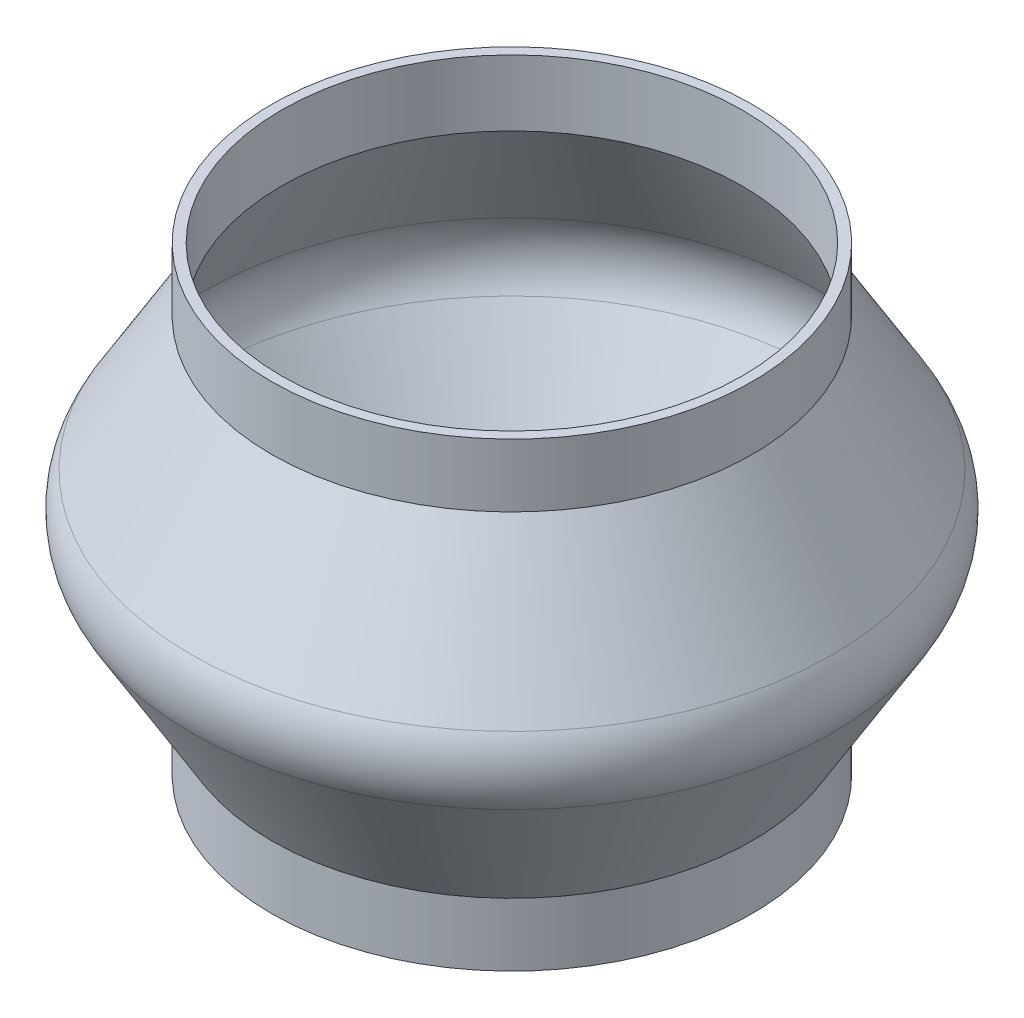
ISO-10303-21;
HEADER;
FILE_DESCRIPTION(('STEP AP214'),'2;1');
FILE_NAME('part.step','',(''),(''),'','','');
FILE_SCHEMA(('AUTOMOTIVE_DESIGN { 1 0 10303 214 1 1 1 1 }'));
ENDSEC;
DATA;
#1=APPLICATION_CONTEXT('core data for automotive mechanical design processes');
#2=APPLICATION_PROTOCOL_DEFINITION('international standard','automotive_design',2000,#1);
#3=PRODUCT_CONTEXT('',#1,'mechanical');
#4=PRODUCT('Part','Part','',(#3));
#5=PRODUCT_RELATED_PRODUCT_CATEGORY('part','',(#4));
#6=PRODUCT_DEFINITION_FORMATION('','',#4);
#7=PRODUCT_DEFINITION_CONTEXT('part definition',#1,'design');
#8=PRODUCT_DEFINITION('design','',#6,#7);
#9=PRODUCT_DEFINITION_SHAPE('','',#8);
#10=(LENGTH_UNIT() NAMED_UNIT(*) SI_UNIT(.MILLI.,.METRE.));
#11=(NAMED_UNIT(*) PLANE_ANGLE_UNIT() SI_UNIT($,.RADIAN.));
#12=(NAMED_UNIT(*) SI_UNIT($,.STERADIAN.) SOLID_ANGLE_UNIT());
#13=UNCERTAINTY_MEASURE_WITH_UNIT(LENGTH_MEASURE(1.E-05),#10,'distance_accuracy_value','');
#14=(GEOMETRIC_REPRESENTATION_CONTEXT(3) GLOBAL_UNCERTAINTY_ASSIGNED_CONTEXT((#13)) GLOBAL_UNIT_ASSIGNED_CONTEXT((#10,
#11,#12)) REPRESENTATION_CONTEXT('',''));
#15=CARTESIAN_POINT('',(0.,0.,0.));
#16=DIRECTION('',(0.,0.,1.));
#17=DIRECTION('',(1.,0.,0.));
#18=AXIS2_PLACEMENT_3D('',#15,#16,#17);
#19=CARTESIAN_POINT('',(-36.5,35.,0.));
#20=DIRECTION('',(0.,1.,0.));
#21=DIRECTION('',(0.,0.,1.));
#22=AXIS2_PLACEMENT_3D('',#19,#20,#21);
#23=PLANE('',#22);
#24=CARTESIAN_POINT('',(0.,35.,0.));
#25=DIRECTION('',(0.,1.,0.));
#26=DIRECTION('',(0.,0.,1.));
#27=AXIS2_PLACEMENT_3D('',#24,#25,#26);
#28=CIRCLE('',#27,36.5);
#29=CARTESIAN_POINT('',(0.,35.,36.5));
#30=VERTEX_POINT('',#29);
#31=EDGE_CURVE('E90',#30,#30,#28,.T.);
#32=ORIENTED_EDGE('',*,*,#31,.T.);
#33=EDGE_LOOP('',(#32));
#34=FACE_BOUND('',#33,.T.);
#35=CARTESIAN_POINT('',(0.,35.,0.));
#36=DIRECTION('',(0.,1.,0.));
#37=DIRECTION('',(0.,0.,1.));
#38=AXIS2_PLACEMENT_3D('',#35,#36,#37);
#39=CIRCLE('',#38,35.);
#40=CARTESIAN_POINT('',(0.,35.,35.));
#41=VERTEX_POINT('',#40);
#42=EDGE_CURVE('E10',#41,#41,#39,.T.);
#43=ORIENTED_EDGE('',*,*,#42,.F.);
#44=EDGE_LOOP('',(#43));
#45=FACE_BOUND('',#44,.T.);
#46=ADVANCED_FACE('F39',(#34,#45),#23,.T.);
#47=CARTESIAN_POINT('',(0.,85.8260869565218,0.));
#48=DIRECTION('',(0.,1.,0.));
#49=DIRECTION('',(0.,0.,1.));
#50=AXIS2_PLACEMENT_3D('',#47,#48,#49);
#51=CYLINDRICAL_SURFACE('',#50,35.);
#52=ORIENTED_EDGE('',*,*,#42,.T.);
#53=EDGE_LOOP('',(#52));
#54=FACE_BOUND('',#53,.T.);
#55=CARTESIAN_POINT('',(0.,25.,0.));
#56=DIRECTION('',(0.,1.,0.));
#57=DIRECTION('',(0.,0.,1.));
#58=AXIS2_PLACEMENT_3D('',#55,#56,#57);
#59=CIRCLE('',#58,35.);
#60=CARTESIAN_POINT('',(0.,25.,35.));
#61=VERTEX_POINT('',#60);
#62=EDGE_CURVE('E46',#61,#61,#59,.T.);
#63=ORIENTED_EDGE('',*,*,#62,.F.);
#64=EDGE_LOOP('',(#63));
#65=FACE_BOUND('',#64,.T.);
#66=ADVANCED_FACE('F109',(#54,#65),#51,.F.);
#67=CARTESIAN_POINT('',(0.,5.1449575542753,0.));
#68=DIRECTION('',(0.,-1.,0.));
#69=DIRECTION('',(0.,0.,-1.));
#70=AXIS2_PLACEMENT_3D('',#67,#68,#69);
#71=CONICAL_SURFACE('',#70,46.9130254674348,0.540419500270584);
#72=ORIENTED_EDGE('',*,*,#62,.T.);
#73=EDGE_LOOP('',(#72));
#74=FACE_BOUND('',#73,.T.);
#75=CARTESIAN_POINT('',(0.,5.1449575542753,0.));
#76=DIRECTION('',(0.,1.,0.));
#77=DIRECTION('',(0.,0.,1.));
#78=AXIS2_PLACEMENT_3D('',#75,#76,#77);
#79=CIRCLE('',#78,46.9130254674348);
#80=CARTESIAN_POINT('',(0.,5.1449575542753,46.9130254674348));
#81=VERTEX_POINT('',#80);
#82=EDGE_CURVE('E51',#81,#81,#79,.T.);
#83=ORIENTED_EDGE('',*,*,#82,.F.);
#84=EDGE_LOOP('',(#83));
#85=FACE_BOUND('',#84,.T.);
#86=ADVANCED_FACE('F113',(#74,#85),#71,.F.);
#87=CARTESIAN_POINT('',(0.,0.,0.));
#88=DIRECTION('',(0.,1.,0.));
#89=DIRECTION('',(0.,0.,1.));
#90=AXIS2_PLACEMENT_3D('',#87,#88,#89);
#91=TOROIDAL_SURFACE('',#90,38.3380962103094,10.);
#92=ORIENTED_EDGE('',*,*,#82,.T.);
#93=EDGE_LOOP('',(#92));
#94=FACE_BOUND('',#93,.T.);
#95=CARTESIAN_POINT('',(0.,-5.1449575542753,0.));
#96=DIRECTION('',(0.,1.,0.));
#97=DIRECTION('',(0.,0.,1.));
#98=AXIS2_PLACEMENT_3D('',#95,#96,#97);
#99=CIRCLE('',#98,46.9130254674348);
#100=CARTESIAN_POINT('',(0.,-5.1449575542753,46.9130254674348));
#101=VERTEX_POINT('',#100);
#102=EDGE_CURVE('E56',#101,#101,#99,.T.);
#103=ORIENTED_EDGE('',*,*,#102,.F.);
#104=EDGE_LOOP('',(#103));
#105=FACE_BOUND('',#104,.T.);
#106=ADVANCED_FACE('F117',(#94,#105),#91,.F.);
#107=CARTESIAN_POINT('',(0.,-25.,0.));
#108=DIRECTION('',(0.,1.,0.));
#109=DIRECTION('',(0.,0.,1.));
#110=AXIS2_PLACEMENT_3D('',#107,#108,#109);
#111=CONICAL_SURFACE('',#110,35.,0.540419500270584);
#112=ORIENTED_EDGE('',*,*,#102,.T.);
#113=EDGE_LOOP('',(#112));
#114=FACE_BOUND('',#113,.T.);
#115=CARTESIAN_POINT('',(0.,-25.,0.));
#116=DIRECTION('',(0.,1.,0.));
#117=DIRECTION('',(0.,0.,1.));
#118=AXIS2_PLACEMENT_3D('',#115,#116,#117);
#119=CIRCLE('',#118,35.);
#120=CARTESIAN_POINT('',(0.,-25.,35.));
#121=VERTEX_POINT('',#120);
#122=EDGE_CURVE('E62',#121,#121,#119,.T.);
#123=ORIENTED_EDGE('',*,*,#122,.F.);
#124=EDGE_LOOP('',(#123));
#125=FACE_BOUND('',#124,.T.);
#126=ADVANCED_FACE('F123',(#114,#125),#111,.F.);
#127=CARTESIAN_POINT('',(0.,85.8260869565218,0.));
#128=DIRECTION('',(0.,1.,0.));
#129=DIRECTION('',(0.,0.,1.));
#130=AXIS2_PLACEMENT_3D('',#127,#128,#129);
#131=CYLINDRICAL_SURFACE('',#130,35.);
#132=ORIENTED_EDGE('',*,*,#122,.T.);
#133=EDGE_LOOP('',(#132));
#134=FACE_BOUND('',#133,.T.);
#135=CARTESIAN_POINT('',(0.,-35.,0.));
#136=DIRECTION('',(0.,1.,0.));
#137=DIRECTION('',(0.,0.,1.));
#138=AXIS2_PLACEMENT_3D('',#135,#136,#137);
#139=CIRCLE('',#138,35.);
#140=CARTESIAN_POINT('',(0.,-35.,35.));
#141=VERTEX_POINT('',#140);
#142=EDGE_CURVE('E66',#141,#141,#139,.T.);
#143=ORIENTED_EDGE('',*,*,#142,.F.);
#144=EDGE_LOOP('',(#143));
#145=FACE_BOUND('',#144,.T.);
#146=ADVANCED_FACE('F127',(#134,#145),#131,.F.);
#147=CARTESIAN_POINT('',(-36.5,-35.,0.));
#148=DIRECTION('',(0.,-1.,0.));
#149=DIRECTION('',(0.,0.,-1.));
#150=AXIS2_PLACEMENT_3D('',#147,#148,#149);
#151=PLANE('',#150);
#152=ORIENTED_EDGE('',*,*,#142,.T.);
#153=EDGE_LOOP('',(#152));
#154=FACE_BOUND('',#153,.T.);
#155=CARTESIAN_POINT('',(0.,-35.,0.));
#156=DIRECTION('',(0.,1.,0.));
#157=DIRECTION('',(0.,0.,1.));
#158=AXIS2_PLACEMENT_3D('',#155,#156,#157);
#159=CIRCLE('',#158,36.5);
#160=CARTESIAN_POINT('',(0.,-35.,36.5));
#161=VERTEX_POINT('',#160);
#162=EDGE_CURVE('E70',#161,#161,#159,.T.);
#163=ORIENTED_EDGE('',*,*,#162,.F.);
#164=EDGE_LOOP('',(#163));
#165=FACE_BOUND('',#164,.T.);
#166=ADVANCED_FACE('F131',(#154,#165),#151,.T.);
#167=CARTESIAN_POINT('',(0.,85.8260869565218,0.));
#168=DIRECTION('',(0.,1.,0.));
#169=DIRECTION('',(0.,0.,1.));
#170=AXIS2_PLACEMENT_3D('',#167,#168,#169);
#171=CYLINDRICAL_SURFACE('',#170,36.5);
#172=ORIENTED_EDGE('',*,*,#162,.T.);
#173=EDGE_LOOP('',(#172));
#174=FACE_BOUND('',#173,.T.);
#175=CARTESIAN_POINT('',(0.,-25.4154759474227,0.));
#176=DIRECTION('',(0.,1.,0.));
#177=DIRECTION('',(0.,0.,1.));
#178=AXIS2_PLACEMENT_3D('',#175,#176,#177);
#179=CIRCLE('',#178,36.5);
#180=CARTESIAN_POINT('',(0.,-25.4154759474227,36.5));
#181=VERTEX_POINT('',#180);
#182=EDGE_CURVE('E74',#181,#181,#179,.T.);
#183=ORIENTED_EDGE('',*,*,#182,.F.);
#184=EDGE_LOOP('',(#183));
#185=FACE_BOUND('',#184,.T.);
#186=ADVANCED_FACE('F135',(#174,#185),#171,.T.);
#187=CARTESIAN_POINT('',(0.,-5.1449575542753,0.));
#188=DIRECTION('',(0.,1.,0.));
#189=DIRECTION('',(0.,0.,1.));
#190=AXIS2_PLACEMENT_3D('',#187,#188,#189);
#191=CONICAL_SURFACE('',#190,48.6623110358884,0.540419500270584);
#192=ORIENTED_EDGE('',*,*,#182,.T.);
#193=EDGE_LOOP('',(#192));
#194=FACE_BOUND('',#193,.T.);
#195=CARTESIAN_POINT('',(0.,-5.1449575542753,0.));
#196=DIRECTION('',(0.,1.,0.));
#197=DIRECTION('',(0.,0.,1.));
#198=AXIS2_PLACEMENT_3D('',#195,#196,#197);
#199=CIRCLE('',#198,48.6623110358884);
#200=CARTESIAN_POINT('',(0.,-5.1449575542753,48.6623110358884));
#201=VERTEX_POINT('',#200);
#202=EDGE_CURVE('E78',#201,#201,#199,.T.);
#203=ORIENTED_EDGE('',*,*,#202,.F.);
#204=EDGE_LOOP('',(#203));
#205=FACE_BOUND('',#204,.T.);
#206=ADVANCED_FACE('F139',(#194,#205),#191,.T.);
#207=CARTESIAN_POINT('',(0.,0.,0.));
#208=DIRECTION('',(0.,1.,0.));
#209=DIRECTION('',(0.,0.,1.));
#210=AXIS2_PLACEMENT_3D('',#207,#208,#209);
#211=TOROIDAL_SURFACE('',#210,40.087381778763,10.);
#212=ORIENTED_EDGE('',*,*,#202,.T.);
#213=EDGE_LOOP('',(#212));
#214=FACE_BOUND('',#213,.T.);
#215=CARTESIAN_POINT('',(0.,5.1449575542753,0.));
#216=DIRECTION('',(0.,1.,0.));
#217=DIRECTION('',(0.,0.,1.));
#218=AXIS2_PLACEMENT_3D('',#215,#216,#217);
#219=CIRCLE('',#218,48.6623110358884);
#220=CARTESIAN_POINT('',(0.,5.1449575542753,48.6623110358884));
#221=VERTEX_POINT('',#220);
#222=EDGE_CURVE('E82',#221,#221,#219,.T.);
#223=ORIENTED_EDGE('',*,*,#222,.F.);
#224=EDGE_LOOP('',(#223));
#225=FACE_BOUND('',#224,.T.);
#226=ADVANCED_FACE('F105',(#214,#225),#211,.T.);
#227=CARTESIAN_POINT('',(0.,25.4154759474227,0.));
#228=DIRECTION('',(0.,-1.,0.));
#229=DIRECTION('',(0.,0.,-1.));
#230=AXIS2_PLACEMENT_3D('',#227,#228,#229);
#231=CONICAL_SURFACE('',#230,36.5,0.540419500270584);
#232=ORIENTED_EDGE('',*,*,#222,.T.);
#233=EDGE_LOOP('',(#232));
#234=FACE_BOUND('',#233,.T.);
#235=CARTESIAN_POINT('',(0.,25.4154759474227,0.));
#236=DIRECTION('',(0.,1.,0.));
#237=DIRECTION('',(0.,0.,1.));
#238=AXIS2_PLACEMENT_3D('',#235,#236,#237);
#239=CIRCLE('',#238,36.5);
#240=CARTESIAN_POINT('',(0.,25.4154759474227,36.5));
#241=VERTEX_POINT('',#240);
#242=EDGE_CURVE('E86',#241,#241,#239,.T.);
#243=ORIENTED_EDGE('',*,*,#242,.F.);
#244=EDGE_LOOP('',(#243));
#245=FACE_BOUND('',#244,.T.);
#246=ADVANCED_FACE('F99',(#234,#245),#231,.T.);
#247=CARTESIAN_POINT('',(0.,85.8260869565218,0.));
#248=DIRECTION('',(0.,1.,0.));
#249=DIRECTION('',(0.,0.,1.));
#250=AXIS2_PLACEMENT_3D('',#247,#248,#249);
#251=CYLINDRICAL_SURFACE('',#250,36.5);
#252=ORIENTED_EDGE('',*,*,#242,.T.);
#253=EDGE_LOOP('',(#252));
#254=FACE_BOUND('',#253,.T.);
#255=ORIENTED_EDGE('',*,*,#31,.F.);
#256=EDGE_LOOP('',(#255));
#257=FACE_BOUND('',#256,.T.);
#258=ADVANCED_FACE('F97',(#254,#257),#251,.T.);
#259=CLOSED_SHELL('',(#46,#66,#86,#106,#126,#146,#166,#186,#206,#226,#246,#258));
#260=MANIFOLD_SOLID_BREP('B2',#259);
#261=ADVANCED_BREP_SHAPE_REPRESENTATION('',(#18,#260),#14);
#262=SHAPE_DEFINITION_REPRESENTATION(#9,#261);
ENDSEC;
END-ISO-10303-21;
